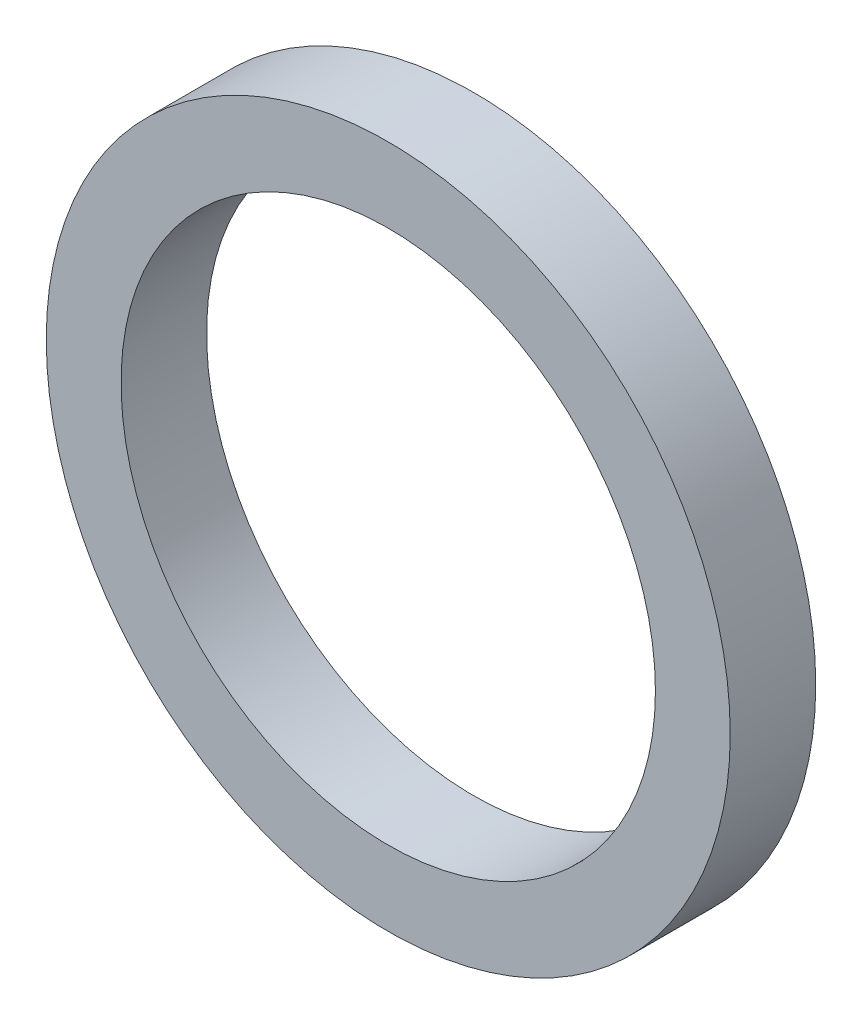
ISO-10303-21;
HEADER;
FILE_DESCRIPTION(('STEP AP214'),'2;1');
FILE_NAME('part.step','',(''),(''),'','','');
FILE_SCHEMA(('AUTOMOTIVE_DESIGN { 1 0 10303 214 1 1 1 1 }'));
ENDSEC;
DATA;
#1=APPLICATION_CONTEXT('core data for automotive mechanical design processes');
#2=APPLICATION_PROTOCOL_DEFINITION('international standard','automotive_design',2000,#1);
#3=PRODUCT_CONTEXT('',#1,'mechanical');
#4=PRODUCT('Part','Part','',(#3));
#5=PRODUCT_RELATED_PRODUCT_CATEGORY('part','',(#4));
#6=PRODUCT_DEFINITION_FORMATION('','',#4);
#7=PRODUCT_DEFINITION_CONTEXT('part definition',#1,'design');
#8=PRODUCT_DEFINITION('design','',#6,#7);
#9=PRODUCT_DEFINITION_SHAPE('','',#8);
#10=(LENGTH_UNIT() NAMED_UNIT(*) SI_UNIT(.MILLI.,.METRE.));
#11=(NAMED_UNIT(*) PLANE_ANGLE_UNIT() SI_UNIT($,.RADIAN.));
#12=(NAMED_UNIT(*) SI_UNIT($,.STERADIAN.) SOLID_ANGLE_UNIT());
#13=UNCERTAINTY_MEASURE_WITH_UNIT(LENGTH_MEASURE(1.E-05),#10,'distance_accuracy_value','');
#14=(GEOMETRIC_REPRESENTATION_CONTEXT(3) GLOBAL_UNCERTAINTY_ASSIGNED_CONTEXT((#13)) GLOBAL_UNIT_ASSIGNED_CONTEXT((#10,
#11,#12)) REPRESENTATION_CONTEXT('',''));
#15=CARTESIAN_POINT('',(0.,0.,0.));
#16=DIRECTION('',(0.,0.,1.));
#17=DIRECTION('',(1.,0.,0.));
#18=AXIS2_PLACEMENT_3D('',#15,#16,#17);
#19=CARTESIAN_POINT('',(0.,0.,2.));
#20=DIRECTION('',(0.,0.,1.));
#21=DIRECTION('',(1.,0.,0.));
#22=AXIS2_PLACEMENT_3D('',#19,#20,#21);
#23=PLANE('',#22);
#24=CARTESIAN_POINT('',(0.,0.,2.));
#25=DIRECTION('',(0.,0.,1.));
#26=DIRECTION('',(1.,0.,0.));
#27=AXIS2_PLACEMENT_3D('',#24,#25,#26);
#28=CIRCLE('',#27,16.);
#29=CARTESIAN_POINT('',(16.,0.,2.));
#30=VERTEX_POINT('',#29);
#31=EDGE_CURVE('E10',#30,#30,#28,.T.);
#32=ORIENTED_EDGE('',*,*,#31,.T.);
#33=EDGE_LOOP('',(#32));
#34=FACE_BOUND('',#33,.T.);
#35=CARTESIAN_POINT('',(0.,0.,2.));
#36=DIRECTION('',(0.,0.,1.));
#37=DIRECTION('',(1.,0.,0.));
#38=AXIS2_PLACEMENT_3D('',#35,#36,#37);
#39=CIRCLE('',#38,12.5);
#40=CARTESIAN_POINT('',(12.5,0.,2.));
#41=VERTEX_POINT('',#40);
#42=EDGE_CURVE('E44',#41,#41,#39,.T.);
#43=ORIENTED_EDGE('',*,*,#42,.F.);
#44=EDGE_LOOP('',(#43));
#45=FACE_BOUND('',#44,.T.);
#46=ADVANCED_FACE('F33',(#34,#45),#23,.T.);
#47=CARTESIAN_POINT('',(0.,0.,-2.));
#48=DIRECTION('',(0.,0.,1.));
#49=DIRECTION('',(1.,0.,0.));
#50=AXIS2_PLACEMENT_3D('',#47,#48,#49);
#51=PLANE('',#50);
#52=CARTESIAN_POINT('',(0.,0.,-2.));
#53=DIRECTION('',(0.,0.,1.));
#54=DIRECTION('',(1.,0.,0.));
#55=AXIS2_PLACEMENT_3D('',#52,#53,#54);
#56=CIRCLE('',#55,16.);
#57=CARTESIAN_POINT('',(16.,0.,-2.));
#58=VERTEX_POINT('',#57);
#59=EDGE_CURVE('E37',#58,#58,#56,.T.);
#60=ORIENTED_EDGE('',*,*,#59,.F.);
#61=EDGE_LOOP('',(#60));
#62=FACE_BOUND('',#61,.T.);
#63=CARTESIAN_POINT('',(0.,0.,-2.));
#64=DIRECTION('',(0.,0.,1.));
#65=DIRECTION('',(1.,0.,0.));
#66=AXIS2_PLACEMENT_3D('',#63,#64,#65);
#67=CIRCLE('',#66,12.5);
#68=CARTESIAN_POINT('',(12.5,0.,-2.));
#69=VERTEX_POINT('',#68);
#70=EDGE_CURVE('E46',#69,#69,#67,.T.);
#71=ORIENTED_EDGE('',*,*,#70,.T.);
#72=EDGE_LOOP('',(#71));
#73=FACE_BOUND('',#72,.T.);
#74=ADVANCED_FACE('F56',(#62,#73),#51,.F.);
#75=CARTESIAN_POINT('',(0.,0.,2.));
#76=DIRECTION('',(0.,0.,-1.));
#77=DIRECTION('',(-1.,0.,0.));
#78=AXIS2_PLACEMENT_3D('',#75,#76,#77);
#79=CYLINDRICAL_SURFACE('',#78,16.);
#80=ORIENTED_EDGE('',*,*,#31,.F.);
#81=EDGE_LOOP('',(#80));
#82=FACE_BOUND('',#81,.T.);
#83=ORIENTED_EDGE('',*,*,#59,.T.);
#84=EDGE_LOOP('',(#83));
#85=FACE_BOUND('',#84,.T.);
#86=ADVANCED_FACE('F35',(#82,#85),#79,.T.);
#87=CARTESIAN_POINT('',(0.,0.,2.));
#88=DIRECTION('',(0.,0.,-1.));
#89=DIRECTION('',(-1.,0.,0.));
#90=AXIS2_PLACEMENT_3D('',#87,#88,#89);
#91=CYLINDRICAL_SURFACE('',#90,12.5);
#92=ORIENTED_EDGE('',*,*,#42,.T.);
#93=EDGE_LOOP('',(#92));
#94=FACE_BOUND('',#93,.T.);
#95=ORIENTED_EDGE('',*,*,#70,.F.);
#96=EDGE_LOOP('',(#95));
#97=FACE_BOUND('',#96,.T.);
#98=ADVANCED_FACE('F52',(#94,#97),#91,.F.);
#99=CLOSED_SHELL('',(#46,#74,#86,#98));
#100=MANIFOLD_SOLID_BREP('B2',#99);
#101=ADVANCED_BREP_SHAPE_REPRESENTATION('',(#18,#100),#14);
#102=SHAPE_DEFINITION_REPRESENTATION(#9,#101);
ENDSEC;
END-ISO-10303-21;
